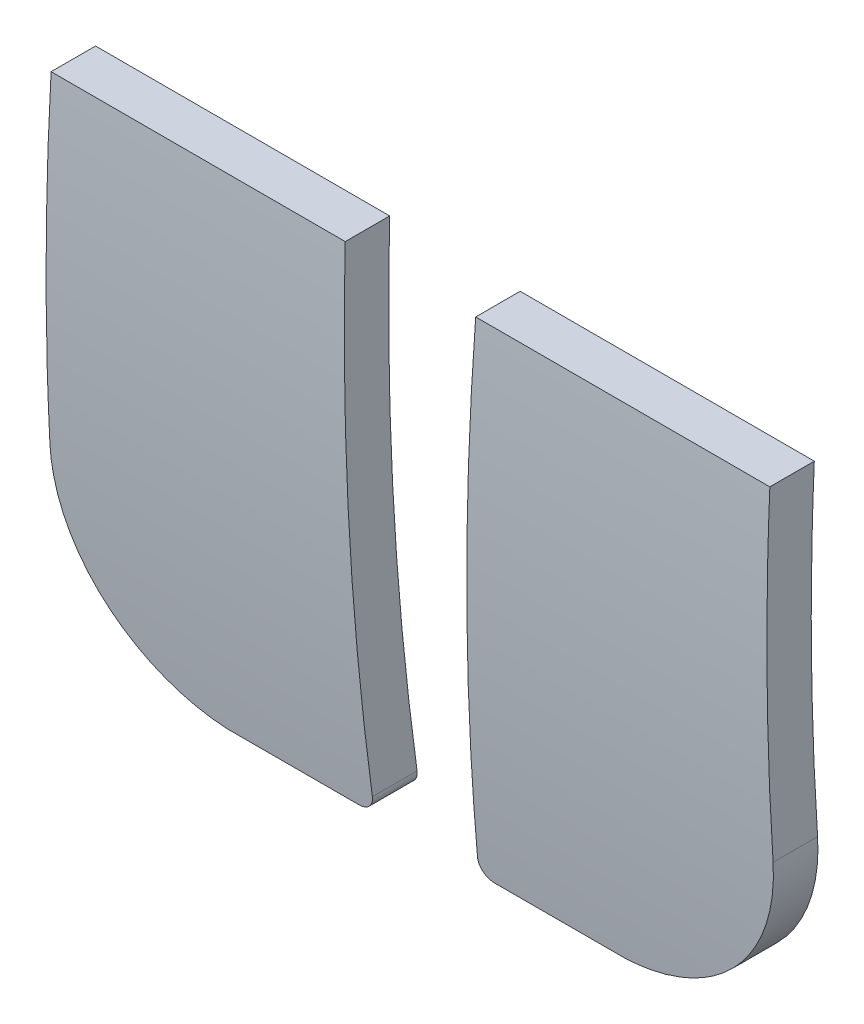
ISO-10303-21;
HEADER;
FILE_DESCRIPTION(('STEP AP214'),'2;1');
FILE_NAME('part.step','',(''),(''),'','','');
FILE_SCHEMA(('AUTOMOTIVE_DESIGN { 1 0 10303 214 1 1 1 1 }'));
ENDSEC;
DATA;
#1=APPLICATION_CONTEXT('core data for automotive mechanical design processes');
#2=APPLICATION_PROTOCOL_DEFINITION('international standard','automotive_design',2000,#1);
#3=PRODUCT_CONTEXT('',#1,'mechanical');
#4=PRODUCT('Part','Part','',(#3));
#5=PRODUCT_RELATED_PRODUCT_CATEGORY('part','',(#4));
#6=PRODUCT_DEFINITION_FORMATION('','',#4);
#7=PRODUCT_DEFINITION_CONTEXT('part definition',#1,'design');
#8=PRODUCT_DEFINITION('design','',#6,#7);
#9=PRODUCT_DEFINITION_SHAPE('','',#8);
#10=(LENGTH_UNIT() NAMED_UNIT(*) SI_UNIT(.MILLI.,.METRE.));
#11=(NAMED_UNIT(*) PLANE_ANGLE_UNIT() SI_UNIT($,.RADIAN.));
#12=(NAMED_UNIT(*) SI_UNIT($,.STERADIAN.) SOLID_ANGLE_UNIT());
#13=UNCERTAINTY_MEASURE_WITH_UNIT(LENGTH_MEASURE(1.E-05),#10,'distance_accuracy_value','');
#14=(GEOMETRIC_REPRESENTATION_CONTEXT(3) GLOBAL_UNCERTAINTY_ASSIGNED_CONTEXT((#13)) GLOBAL_UNIT_ASSIGNED_CONTEXT((#10,
#11,#12)) REPRESENTATION_CONTEXT('',''));
#15=CARTESIAN_POINT('',(0.,0.,0.));
#16=DIRECTION('',(0.,0.,1.));
#17=DIRECTION('',(1.,0.,0.));
#18=AXIS2_PLACEMENT_3D('',#15,#16,#17);
#19=CARTESIAN_POINT('',(536.140350875402,475.456721631804,110.999999999999));
#20=DIRECTION('',(-0.999654061556553,-0.0263012777918944,0.));
#21=DIRECTION('',(0.0263012777918946,-0.999654061556546,0.));
#22=AXIS2_PLACEMENT_3D('',#19,#20,#21);
#23=PLANE('',#22);
#24=CARTESIAN_POINT('',(535.619107961521,495.26802509934,-119.051940911858));
#25=DIRECTION('',(-0.999654061556553,-0.0263012777918944,0.));
#26=DIRECTION('',(-0.0263012777918946,0.999654061556546,0.));
#27=AXIS2_PLACEMENT_3D('',#24,#25,#26);
#28=ELLIPSE('',#27,174.492026428752,174.45060758446);
#29=CARTESIAN_POINT('',(536.140350875403,475.456721631805,54.2698450307609));
#30=VERTEX_POINT('',#29);
#31=CARTESIAN_POINT('',(535.376458863718,504.490586758564,55.1546616225943));
#32=VERTEX_POINT('',#31);
#33=EDGE_CURVE('E159',#30,#32,#28,.T.);
#34=ORIENTED_EDGE('',*,*,#33,.T.);
#35=DIRECTION('',(0.,0.,0.999999999999992));
#36=VECTOR('',#35,1.);
#37=CARTESIAN_POINT('',(535.376458863718,504.490586758564,110.999999999999));
#38=LINE('',#37,#36);
#39=CARTESIAN_POINT('',(535.376458863718,504.490586758563,57.8345842835043));
#40=VERTEX_POINT('',#39);
#41=EDGE_CURVE('E100',#32,#40,#38,.T.);
#42=ORIENTED_EDGE('',*,*,#41,.T.);
#43=CARTESIAN_POINT('',(535.619107961521,495.26802509934,-119.051940911858));
#44=DIRECTION('',(-0.999654061556553,-0.0263012777918944,0.));
#45=DIRECTION('',(-0.0263012777918946,0.999654061556546,0.));
#46=AXIS2_PLACEMENT_3D('',#43,#44,#45);
#47=ELLIPSE('',#46,177.168892743277,177.12683849626);
#48=CARTESIAN_POINT('',(536.140350875403,475.456721631805,56.9632399999936));
#49=VERTEX_POINT('',#48);
#50=EDGE_CURVE('E125',#40,#49,#47,.F.);
#51=ORIENTED_EDGE('',*,*,#50,.T.);
#52=DIRECTION('',(0.,0.,-0.999999999999992));
#53=VECTOR('',#52,1.);
#54=CARTESIAN_POINT('',(536.140350875402,475.456721631804,110.999999999999));
#55=LINE('',#54,#53);
#56=EDGE_CURVE('E174',#49,#30,#55,.T.);
#57=ORIENTED_EDGE('',*,*,#56,.T.);
#58=EDGE_LOOP('',(#34,#42,#51,#57));
#59=FACE_BOUND('',#58,.T.);
#60=ADVANCED_FACE('F54',(#59),#23,.F.);
#61=CARTESIAN_POINT('',(535.231574455896,475.432811379267,110.999999999999));
#62=DIRECTION('',(0.,0.,-0.999999999999992));
#63=DIRECTION('',(-1.,0.,0.));
#64=AXIS2_PLACEMENT_3D('',#61,#62,#63);
#65=CYLINDRICAL_SURFACE('',#64,0.909090909000402);
#66=ORIENTED_EDGE('',*,*,#56,.F.);
#67=CARTESIAN_POINT('',(536.140350875403,475.456721631805,56.9632399999936));
#68=CARTESIAN_POINT('',(536.14174518373,475.40533194349,56.9574554709176));
#69=CARTESIAN_POINT('',(536.138698001544,475.353841025974,56.9516372540305));
#70=CARTESIAN_POINT('',(536.123996000323,475.25212307305,56.9401044015353));
#71=CARTESIAN_POINT('',(536.112346619781,475.201895259819,56.9343897028185));
#72=CARTESIAN_POINT('',(536.080708378065,475.104075764882,56.9232241972105));
#73=CARTESIAN_POINT('',(536.060715163194,475.056485474107,56.9177735297465));
#74=CARTESIAN_POINT('',(536.012957868618,474.965338029349,56.907304634822));
#75=CARTESIAN_POINT('',(535.985195364171,474.921780060175,56.9022863199694));
#76=CARTESIAN_POINT('',(535.922743558831,474.840046086445,56.89284804899));
#77=CARTESIAN_POINT('',(535.888071364855,474.801857179763,56.8884266594746));
#78=CARTESIAN_POINT('',(535.812722900101,474.731842494284,56.8803075346735));
#79=CARTESIAN_POINT('',(535.772045848254,474.700017544534,56.8766098936734));
#80=CARTESIAN_POINT('',(535.686109211178,474.643847029556,56.8700792423017));
#81=CARTESIAN_POINT('',(535.640878345901,474.61945806932,56.8672412160468));
#82=CARTESIAN_POINT('',(535.546923853915,474.578632759,56.8624945115349));
#83=CARTESIAN_POINT('',(535.498201997904,474.562192409558,56.8605853659069));
#84=CARTESIAN_POINT('',(535.412994128215,474.541257365361,56.8581651903256));
#85=CARTESIAN_POINT('',(535.377010108983,474.534688361436,56.857410145781));
#86=CARTESIAN_POINT('',(535.304547175538,474.525918358229,56.8564148293218));
#87=CARTESIAN_POINT('',(535.268068849955,474.523712556748,56.8561739914414));
#88=CARTESIAN_POINT('',(535.231574455899,474.523720470266,56.8561945203728));
#89=B_SPLINE_CURVE_WITH_KNOTS('',3,(#67,#68,#69,#70,#71,#72,#73,#74,#75,#76,#77,#78,#79,#80,#81,
#82,#83,#84,#85,#86,#87,#88),.UNSPECIFIED.,.F.,.F.,(4,2,2,2,2,2,2,2,2,2,4),(0.,0.15499568747238,
0.30989346716666,0.464872171625636,0.619819476190306,0.774387826309944,0.928976299305122,
1.08264454954409,1.23623540064641,1.34574069218064,1.45512539353351),.UNSPECIFIED.);
#90=CARTESIAN_POINT('',(535.231574455899,474.523720470266,56.8561945203729));
#91=VERTEX_POINT('',#90);
#92=EDGE_CURVE('E166',#49,#91,#89,.T.);
#93=ORIENTED_EDGE('',*,*,#92,.T.);
#94=DIRECTION('',(0.,0.,-0.999999999999992));
#95=VECTOR('',#94,1.);
#96=CARTESIAN_POINT('',(535.231574455899,474.523720470266,110.999999999999));
#97=LINE('',#96,#95);
#98=CARTESIAN_POINT('',(535.231574455899,474.523720470266,54.1611350441775));
#99=VERTEX_POINT('',#98);
#100=EDGE_CURVE('E158',#91,#99,#97,.T.);
#101=ORIENTED_EDGE('',*,*,#100,.T.);
#102=CARTESIAN_POINT('',(535.231574455899,474.523720470266,54.1611350441775));
#103=CARTESIAN_POINT('',(535.282456947394,474.523675843275,54.161101545679));
#104=CARTESIAN_POINT('',(535.333324549089,474.527989635338,54.1615912439828));
#105=CARTESIAN_POINT('',(535.433567432787,474.545002286265,54.1635734579469));
#106=CARTESIAN_POINT('',(535.482944158427,474.557692742551,54.165064968722));
#107=CARTESIAN_POINT('',(535.57886989596,474.59113498582,54.1690081401541));
#108=CARTESIAN_POINT('',(535.625417745703,474.611890060344,54.1714601923791));
#109=CARTESIAN_POINT('',(535.714354599843,474.660837071031,54.1772420230476));
#110=CARTESIAN_POINT('',(535.756744032862,474.689028239626,54.1805717108999));
#111=CARTESIAN_POINT('',(535.836320112265,474.752137879461,54.188014619178));
#112=CARTESIAN_POINT('',(535.873489797929,474.787077443125,54.1921302957828));
#113=CARTESIAN_POINT('',(535.941448036771,474.862629269284,54.2010095048129));
#114=CARTESIAN_POINT('',(535.972235561353,474.903242444417,54.2057731414636));
#115=CARTESIAN_POINT('',(536.026769120351,474.989275847245,54.2158357106725));
#116=CARTESIAN_POINT('',(536.050466164029,475.034726705185,54.2211380430928));
#117=CARTESIAN_POINT('',(536.089886829561,475.12891913603,54.23209117822));
#118=CARTESIAN_POINT('',(536.105612989336,475.177659655903,54.2377418693661));
#119=CARTESIAN_POINT('',(536.12585769826,475.264906228526,54.2478218102338));
#120=CARTESIAN_POINT('',(536.1321739604,475.303010246547,54.2522129635392));
#121=CARTESIAN_POINT('',(536.139929286843,475.379666267343,54.2610236763373));
#122=CARTESIAN_POINT('',(536.141373547402,475.418217748793,54.2654432005254));
#123=CARTESIAN_POINT('',(536.140350875403,475.456721631805,54.2698450307608));
#124=B_SPLINE_CURVE_WITH_KNOTS('',3,(#102,#103,#104,#105,#106,#107,#108,#109,#110,#111,#112,
#113,#114,#115,#116,#117,#118,#119,#120,#121,#122,#123),.UNSPECIFIED.,.F.,.F.,(4,2,2,2,2,2,2,2,
2,2,4),(0.,0.152440184345193,0.30472768882701,0.457077338519211,0.609411268537098,
0.762229264094853,0.915071869804436,1.06894735026415,1.22277380610403,1.33909581069484,
1.45529371218905),.UNSPECIFIED.);
#125=EDGE_CURVE('E149',#99,#30,#124,.T.);
#126=ORIENTED_EDGE('',*,*,#125,.T.);
#127=EDGE_LOOP('',(#66,#93,#101,#126));
#128=FACE_BOUND('',#127,.T.);
#129=ADVANCED_FACE('F160',(#128),#65,.T.);
#130=CARTESIAN_POINT('',(527.266966018069,474.523720470267,110.999999999998));
#131=DIRECTION('',(-1.11515645367699E-13,0.999999999999996,0.));
#132=DIRECTION('',(-1.,-1.11515641556051E-13,0.));
#133=AXIS2_PLACEMENT_3D('',#130,#131,#132);
#134=PLANE('',#133);
#135=ORIENTED_EDGE('',*,*,#100,.F.);
#136=CARTESIAN_POINT('',(-4058.43512311314,474.523720469757,-119.051940911858));
#137=DIRECTION('',(-1.11515645367699E-13,0.999999999999996,0.));
#138=DIRECTION('',(-1.,-1.11515641556051E-13,0.));
#139=AXIS2_PLACEMENT_3D('',#136,#137,#138);
#140=ELLIPSE('',#139,39227.0848358482,177.12683849626);
#141=CARTESIAN_POINT('',(527.26696601807,474.523720470267,56.8604314648169));
#142=VERTEX_POINT('',#141);
#143=EDGE_CURVE('E157',#91,#142,#140,.F.);
#144=ORIENTED_EDGE('',*,*,#143,.T.);
#145=DIRECTION('',(0.,0.,-0.999999999999992));
#146=VECTOR('',#145,1.);
#147=CARTESIAN_POINT('',(527.266966018069,474.523720470267,110.999999999998));
#148=LINE('',#147,#146);
#149=CARTESIAN_POINT('',(527.266966018069,474.523720470267,54.1654379105254));
#150=VERTEX_POINT('',#149);
#151=EDGE_CURVE('E178',#142,#150,#148,.T.);
#152=ORIENTED_EDGE('',*,*,#151,.T.);
#153=CARTESIAN_POINT('',(-4058.43512311314,474.523720469757,-119.051940911858));
#154=DIRECTION('',(-1.11515645367699E-13,0.999999999999996,0.));
#155=DIRECTION('',(-1.,-1.11515641556051E-13,0.));
#156=AXIS2_PLACEMENT_3D('',#153,#154,#155);
#157=ELLIPSE('',#156,38634.3980476193,174.45060758446);
#158=EDGE_CURVE('E136',#150,#99,#157,.T.);
#159=ORIENTED_EDGE('',*,*,#158,.T.);
#160=EDGE_LOOP('',(#135,#144,#152,#159));
#161=FACE_BOUND('',#160,.T.);
#162=ADVANCED_FACE('F163',(#161),#134,.F.);
#163=CARTESIAN_POINT('',(527.925237363076,484.907688786865,110.999999999998));
#164=DIRECTION('',(0.,0.,-0.999999999999992));
#165=DIRECTION('',(-1.,0.,0.));
#166=AXIS2_PLACEMENT_3D('',#163,#164,#165);
#167=CYLINDRICAL_SURFACE('',#166,10.4048123079564);
#168=ORIENTED_EDGE('',*,*,#151,.F.);
#169=CARTESIAN_POINT('',(527.26696601807,474.523720470267,56.8604314648169));
#170=CARTESIAN_POINT('',(526.975887508819,474.542140275798,56.8627490500509));
#171=CARTESIAN_POINT('',(526.685606856177,474.572861274735,56.8665211784255));
#172=CARTESIAN_POINT('',(526.108714324281,474.658532180577,56.876865907868));
#173=CARTESIAN_POINT('',(525.82210217927,474.713480322066,56.8834383048809));
#174=CARTESIAN_POINT('',(525.254854101809,474.847169450611,56.899267586558));
#175=CARTESIAN_POINT('',(524.974212601217,474.925887126533,56.908521840729));
#176=CARTESIAN_POINT('',(524.420606220098,475.10654366231,56.9295489857613));
#177=CARTESIAN_POINT('',(524.147641289298,475.208482370053,56.9413218601242));
#178=CARTESIAN_POINT('',(523.611216907702,475.434878653158,56.9671837642438));
#179=CARTESIAN_POINT('',(523.347760828529,475.559344123718,56.9812736058944));
#180=CARTESIAN_POINT('',(522.832296341451,475.829869960439,57.0115216673345));
#181=CARTESIAN_POINT('',(522.580288228378,475.97593088236,57.0276799403539));
#182=CARTESIAN_POINT('',(522.089520284619,476.288572647983,57.0617863352253));
#183=CARTESIAN_POINT('',(521.850758525195,476.455150492881,57.079734195434));
#184=CARTESIAN_POINT('',(521.388100493214,476.807655501322,57.1171219966519));
#185=CARTESIAN_POINT('',(521.164204189059,476.993582623733,57.1365619344892));
#186=CARTESIAN_POINT('',(520.731940015739,477.384271257166,57.1766994668965));
#187=CARTESIAN_POINT('',(520.523639414842,477.589106702207,57.1974018808239));
#188=CARTESIAN_POINT('',(520.125031288809,478.015513287331,57.2396619104286));
#189=CARTESIAN_POINT('',(519.934723842307,478.237084500545,57.2612195298427));
#190=CARTESIAN_POINT('',(519.573360901964,478.695484126932,57.3048649879234));
#191=CARTESIAN_POINT('',(519.402312192417,478.932317870743,57.3269530101316));
#192=CARTESIAN_POINT('',(519.080738304926,479.419506488047,57.3713232223724));
#193=CARTESIAN_POINT('',(518.930212703041,479.669861082096,57.393605408384));
#194=CARTESIAN_POINT('',(518.650028462786,480.183636927127,57.4381597674262));
#195=CARTESIAN_POINT('',(518.520478759992,480.447117647564,57.4604313245909));
#196=CARTESIAN_POINT('',(518.284092473592,480.984106014947,57.5045474410512));
#197=CARTESIAN_POINT('',(518.177255405818,481.257613448006,57.52639200944));
#198=CARTESIAN_POINT('',(517.987142506752,481.812480112703,57.5693564559241));
#199=CARTESIAN_POINT('',(517.903845875152,482.093832169765,57.5904769592088));
#200=CARTESIAN_POINT('',(517.761316792545,482.662528329023,57.631757960082));
#201=CARTESIAN_POINT('',(517.702075411093,482.949870165802,57.6519188114802));
#202=CARTESIAN_POINT('',(517.610158765996,483.51568263316,57.6901979212879));
#203=CARTESIAN_POINT('',(517.576415949564,483.793976921613,57.708367182422));
#204=CARTESIAN_POINT('',(517.531506739489,484.351966198592,57.7434607465613));
#205=CARTESIAN_POINT('',(517.520300956681,484.631657885334,57.7603871717455));
#206=CARTESIAN_POINT('',(517.520425715415,484.911395605456,57.7766353582668));
#207=B_SPLINE_CURVE_WITH_KNOTS('',3,(#169,#170,#171,#172,#173,#174,#175,#176,#177,#178,#179,
#180,#181,#182,#183,#184,#185,#186,#187,#188,#189,#190,#191,#192,#193,#194,#195,#196,#197,#198,
#199,#200,#201,#202,#203,#204,#205,#206),.UNSPECIFIED.,.F.,.F.,(4,2,2,2,2,2,2,2,2,2,2,2,2,2,2,2,
2,2,4),(0.,0.874737972223941,1.7494122133495,2.6232314193154,3.49704490143656,4.37116523357247,
5.24530806519936,6.11932328126851,6.99333663943121,7.87092529667561,8.7485177890101,
9.62641847076994,10.5043010151818,11.3866058320865,12.26889183892,13.1503958036979,
14.031572212725,14.873425606386,15.7138063652879),.UNSPECIFIED.);
#208=CARTESIAN_POINT('',(517.520425715415,484.911395605456,57.7766353582669));
#209=VERTEX_POINT('',#208);
#210=EDGE_CURVE('E179',#142,#209,#207,.T.);
#211=ORIENTED_EDGE('',*,*,#210,.T.);
#212=DIRECTION('',(0.,0.,-0.999999999999992));
#213=VECTOR('',#212,1.);
#214=CARTESIAN_POINT('',(517.520425715415,484.911395605455,111.));
#215=LINE('',#214,#213);
#216=CARTESIAN_POINT('',(517.520425715415,484.911395605456,55.0958209360234));
#217=VERTEX_POINT('',#216);
#218=EDGE_CURVE('E135',#209,#217,#215,.T.);
#219=ORIENTED_EDGE('',*,*,#218,.T.);
#220=CARTESIAN_POINT('',(517.520425715415,484.911395605456,55.0958209360234));
#221=CARTESIAN_POINT('',(517.520289806741,484.617995009349,55.0785178812559));
#222=CARTESIAN_POINT('',(517.532625518532,484.324641524004,55.0604554932544));
#223=CARTESIAN_POINT('',(517.581990513403,483.740124473096,55.0229882394197));
#224=CARTESIAN_POINT('',(517.619018172725,483.448960764804,55.0035834619381));
#225=CARTESIAN_POINT('',(517.717478143131,482.87111046721,54.9636212459886));
#226=CARTESIAN_POINT('',(517.778890957637,482.584420490895,54.9430647396088));
#227=CARTESIAN_POINT('',(517.925657308827,482.017309248906,54.9010080948807));
#228=CARTESIAN_POINT('',(518.011010677076,481.736887939144,54.8795079631722));
#229=CARTESIAN_POINT('',(518.205080884662,481.18418224198,54.8358094010826));
#230=CARTESIAN_POINT('',(518.313806852309,480.911901081224,54.813610700771));
#231=CARTESIAN_POINT('',(518.553827167054,480.377502333744,54.7688070084009));
#232=CARTESIAN_POINT('',(518.685122020641,480.115384975277,54.7462020072343));
#233=CARTESIAN_POINT('',(518.969322971436,479.603211993992,54.7008986364489));
#234=CARTESIAN_POINT('',(519.122225121594,479.353154179398,54.6782002846162));
#235=CARTESIAN_POINT('',(519.448582719488,478.866810982683,54.6330323261353));
#236=CARTESIAN_POINT('',(519.622038076072,478.630525539489,54.610562718473));
#237=CARTESIAN_POINT('',(519.988578537358,478.173031049163,54.5661543039174));
#238=CARTESIAN_POINT('',(520.181694312071,477.951846485598,54.5442163945591));
#239=CARTESIAN_POINT('',(520.58597151068,477.526538647642,54.5012516040534));
#240=CARTESIAN_POINT('',(520.797132902112,477.322415342561,54.4802247212672));
#241=CARTESIAN_POINT('',(521.236094477772,476.932623146271,54.4394149151141));
#242=CARTESIAN_POINT('',(521.463900313567,476.746960574339,54.4196324185574));
#243=CARTESIAN_POINT('',(521.934476602399,476.395512729864,54.381649101098));
#244=CARTESIAN_POINT('',(522.177246655536,476.229726926489,54.3634482379596));
#245=CARTESIAN_POINT('',(522.675602648814,475.919504717786,54.3289685874537));
#246=CARTESIAN_POINT('',(522.931165423145,475.775031467053,54.3126864929384));
#247=CARTESIAN_POINT('',(523.453679424084,475.508149052617,54.2822910483605));
#248=CARTESIAN_POINT('',(523.72063032688,475.385739262074,54.2681776366857));
#249=CARTESIAN_POINT('',(524.263761305277,475.163989776158,54.2423815967991));
#250=CARTESIAN_POINT('',(524.539932290285,475.064628082489,54.2306966518509));
#251=CARTESIAN_POINT('',(525.099667261961,474.889593778648,54.2099536965693));
#252=CARTESIAN_POINT('',(525.383228326988,474.813911956127,54.2008946647593));
#253=CARTESIAN_POINT('',(525.932469565764,474.691939524672,54.1861886821699));
#254=CARTESIAN_POINT('',(526.197725689705,474.643757519325,54.1803239655258));
#255=CARTESIAN_POINT('',(526.730751196714,474.568163910431,54.1710370426466));
#256=CARTESIAN_POINT('',(526.998515398022,474.540716278693,54.1676106002531));
#257=CARTESIAN_POINT('',(527.266966018069,474.523720470267,54.1654379105254));
#258=B_SPLINE_CURVE_WITH_KNOTS('',3,(#220,#221,#222,#223,#224,#225,#226,#227,#228,#229,#230,
#231,#232,#233,#234,#235,#236,#237,#238,#239,#240,#241,#242,#243,#244,#245,#246,#247,#248,#249,
#250,#251,#252,#253,#254,#255,#256,#257),.UNSPECIFIED.,.F.,.F.,(4,2,2,2,2,2,2,2,2,2,2,2,2,2,2,2,
2,2,4),(0.,0.881457427142949,1.76285689477074,2.64355307451578,3.52424305824527,
4.40527762769156,5.28633197183449,6.16722557954877,7.04811528070232,7.93040085128707,
8.81268483480478,9.69526979990165,10.5778311893314,11.458848449962,12.3398406762283,
13.219988545914,14.0997935784424,14.9079610198805,15.7147209332295),.UNSPECIFIED.);
#259=EDGE_CURVE('E116',#217,#150,#258,.T.);
#260=ORIENTED_EDGE('',*,*,#259,.T.);
#261=EDGE_LOOP('',(#168,#211,#219,#260));
#262=FACE_BOUND('',#261,.T.);
#263=ADVANCED_FACE('F138',(#262),#167,.T.);
#264=CARTESIAN_POINT('',(517.664410905554,508.286343161836,110.999999999999));
#265=DIRECTION('',(0.99998102892226,-0.00615969119236416,0.));
#266=DIRECTION('',(0.00615969119236419,0.999981028922248,0.));
#267=AXIS2_PLACEMENT_3D('',#264,#265,#266);
#268=PLANE('',#267);
#269=CARTESIAN_POINT('',(517.583718921342,495.186586878209,-119.051940911858));
#270=DIRECTION('',(0.99998102892226,-0.00615969119236416,0.));
#271=DIRECTION('',(-0.00615969119236419,-0.999981028922248,0.));
#272=AXIS2_PLACEMENT_3D('',#269,#270,#271);
#273=ELLIPSE('',#272,177.136931591836,177.12683849626);
#274=CARTESIAN_POINT('',(517.641029774707,504.490586758568,57.8303902639352));
#275=VERTEX_POINT('',#274);
#276=EDGE_CURVE('E112',#209,#275,#273,.F.);
#277=ORIENTED_EDGE('',*,*,#276,.T.);
#278=DIRECTION('',(0.,0.,-0.999999999999992));
#279=VECTOR('',#278,1.);
#280=CARTESIAN_POINT('',(517.641029774707,504.490586758564,111.));
#281=LINE('',#280,#279);
#282=CARTESIAN_POINT('',(517.641029774707,504.490586758564,55.1504030823898));
#283=VERTEX_POINT('',#282);
#284=EDGE_CURVE('E102',#275,#283,#281,.T.);
#285=ORIENTED_EDGE('',*,*,#284,.T.);
#286=CARTESIAN_POINT('',(517.583718921342,495.186586878209,-119.051940911858));
#287=DIRECTION('',(0.99998102892226,-0.00615969119236416,0.));
#288=DIRECTION('',(-0.00615969119236419,-0.999981028922248,0.));
#289=AXIS2_PLACEMENT_3D('',#286,#287,#288);
#290=ELLIPSE('',#289,174.460548182229,174.45060758446);
#291=EDGE_CURVE('E110',#283,#217,#290,.T.);
#292=ORIENTED_EDGE('',*,*,#291,.T.);
#293=ORIENTED_EDGE('',*,*,#218,.F.);
#294=EDGE_LOOP('',(#277,#285,#292,#293));
#295=FACE_BOUND('',#294,.T.);
#296=ADVANCED_FACE('F108',(#295),#268,.F.);
#297=CARTESIAN_POINT('',(648.010941806105,495.775526822629,-119.051940911858));
#298=DIRECTION('',(-0.999989805430504,-0.00451542191426788,0.));
#299=DIRECTION('',(0.00451542191426791,-0.999989805430496,0.));
#300=AXIS2_PLACEMENT_3D('',#297,#298,#299);
#301=CYLINDRICAL_SURFACE('',#300,177.12683849626);
#302=ORIENTED_EDGE('',*,*,#50,.F.);
#303=CARTESIAN_POINT('',(2578.0567393239,504.49058675856,-119.051940911858));
#304=DIRECTION('',(0.,-0.999999999999996,0.));
#305=DIRECTION('',(-1.,0.,0.));
#306=AXIS2_PLACEMENT_3D('',#303,#304,#305);
#307=ELLIPSE('',#306,39227.0848348795,177.12683849626);
#308=EDGE_CURVE('E64',#40,#275,#307,.T.);
#309=ORIENTED_EDGE('',*,*,#308,.T.);
#310=ORIENTED_EDGE('',*,*,#276,.F.);
#311=ORIENTED_EDGE('',*,*,#210,.F.);
#312=ORIENTED_EDGE('',*,*,#143,.F.);
#313=ORIENTED_EDGE('',*,*,#92,.F.);
#314=EDGE_LOOP('',(#302,#309,#310,#311,#312,#313));
#315=FACE_BOUND('',#314,.T.);
#316=ADVANCED_FACE('F145',(#315),#301,.T.);
#317=CARTESIAN_POINT('',(648.010941806105,495.775526822629,-119.051940911858));
#318=DIRECTION('',(-0.999989805430504,-0.00451542191426788,0.));
#319=DIRECTION('',(0.00451542191426791,-0.999989805430496,0.));
#320=AXIS2_PLACEMENT_3D('',#317,#318,#319);
#321=CYLINDRICAL_SURFACE('',#320,174.45060758446);
#322=ORIENTED_EDGE('',*,*,#291,.F.);
#323=CARTESIAN_POINT('',(2578.0567393239,504.49058675856,-119.051940911858));
#324=DIRECTION('',(0.,-0.999999999999996,0.));
#325=DIRECTION('',(-1.,0.,0.));
#326=AXIS2_PLACEMENT_3D('',#323,#324,#325);
#327=ELLIPSE('',#326,38634.3980466652,174.45060758446);
#328=EDGE_CURVE('E13',#283,#32,#327,.F.);
#329=ORIENTED_EDGE('',*,*,#328,.T.);
#330=ORIENTED_EDGE('',*,*,#33,.F.);
#331=ORIENTED_EDGE('',*,*,#125,.F.);
#332=ORIENTED_EDGE('',*,*,#158,.F.);
#333=ORIENTED_EDGE('',*,*,#259,.F.);
#334=EDGE_LOOP('',(#322,#329,#330,#331,#332,#333));
#335=FACE_BOUND('',#334,.T.);
#336=ADVANCED_FACE('F114',(#335),#321,.F.);
#337=CARTESIAN_POINT('',(517.641029774711,504.490586758564,-105.));
#338=DIRECTION('',(0.,-0.999999999999996,0.));
#339=DIRECTION('',(0.,0.,-0.999999999999992));
#340=AXIS2_PLACEMENT_3D('',#337,#338,#339);
#341=PLANE('',#340);
#342=ORIENTED_EDGE('',*,*,#41,.F.);
#343=ORIENTED_EDGE('',*,*,#328,.F.);
#344=ORIENTED_EDGE('',*,*,#284,.F.);
#345=ORIENTED_EDGE('',*,*,#308,.F.);
#346=EDGE_LOOP('',(#342,#343,#344,#345));
#347=FACE_BOUND('',#346,.T.);
#348=ADVANCED_FACE('F56',(#347),#341,.F.);
#349=CLOSED_SHELL('',(#60,#129,#162,#263,#296,#316,#336,#348));
#350=MANIFOLD_SOLID_BREP('B2',#349);
#351=CARTESIAN_POINT('',(543.386399128993,475.432811379267,110.999999999998));
#352=DIRECTION('',(0.,0.,-0.999999999999992));
#353=DIRECTION('',(-1.,0.,0.));
#354=AXIS2_PLACEMENT_3D('',#351,#352,#353);
#355=CYLINDRICAL_SURFACE('',#354,0.909090909000402);
#356=DIRECTION('',(0.,0.,-0.999999999999992));
#357=VECTOR('',#356,1.);
#358=CARTESIAN_POINT('',(543.386399128993,474.523720470267,110.999999999999));
#359=LINE('',#358,#357);
#360=CARTESIAN_POINT('',(543.386399128994,474.523720470267,56.8518486623192));
#361=VERTEX_POINT('',#360);
#362=CARTESIAN_POINT('',(543.386399128994,474.523720470267,54.1567215662743));
#363=VERTEX_POINT('',#362);
#364=EDGE_CURVE('E440',#361,#363,#359,.T.);
#365=ORIENTED_EDGE('',*,*,#364,.F.);
#366=CARTESIAN_POINT('',(543.386399128994,474.523720470267,56.8518486623193));
#367=CARTESIAN_POINT('',(543.335504834858,474.523675886622,56.8518699161749));
#368=CARTESIAN_POINT('',(543.284626030305,474.527991617218,56.8524074753501));
#369=CARTESIAN_POINT('',(543.184362054058,474.54501167573,56.8544704551497));
#370=CARTESIAN_POINT('',(543.134975440391,474.55770761544,56.8559948879295));
#371=CARTESIAN_POINT('',(543.039031600906,474.59116408154,56.8599878964958));
#372=CARTESIAN_POINT('',(542.992475535149,474.611927889009,56.8624568564008));
#373=CARTESIAN_POINT('',(542.903524181437,474.660895622466,56.8682560862241));
#374=CARTESIAN_POINT('',(542.86112846379,474.689098778986,56.8715862670637));
#375=CARTESIAN_POINT('',(542.781542916913,474.752235247181,56.8790138203234));
#376=CARTESIAN_POINT('',(542.744369973962,474.787189559273,56.8831135854948));
#377=CARTESIAN_POINT('',(542.676408435411,474.862773932739,56.8919452818127));
#378=CARTESIAN_POINT('',(542.645620868446,474.903404906818,56.896677314611));
#379=CARTESIAN_POINT('',(542.591095758783,474.989469956477,56.906661103508));
#380=CARTESIAN_POINT('',(542.567406114902,475.034933978406,56.9119160853426));
#381=CARTESIAN_POINT('',(542.528003332903,475.129153389746,56.9227612373451));
#382=CARTESIAN_POINT('',(542.512287621612,475.177907711622,56.9283512987316));
#383=CARTESIAN_POINT('',(542.492076581692,475.26512612405,56.9383089020854));
#384=CARTESIAN_POINT('',(542.485776097476,475.303186782808,56.9426406341893));
#385=CARTESIAN_POINT('',(542.478041025711,475.379754914406,56.9513270458765));
#386=CARTESIAN_POINT('',(542.476601250616,475.418261866858,56.9556816960248));
#387=CARTESIAN_POINT('',(542.477622709486,475.456721631804,56.9600164958012));
#388=B_SPLINE_CURVE_WITH_KNOTS('',3,(#366,#367,#368,#369,#370,#371,#372,#373,#374,#375,#376,
#377,#378,#379,#380,#381,#382,#383,#384,#385,#386,#387),.UNSPECIFIED.,.F.,.F.,(4,2,2,2,2,2,2,2,
2,2,4),(0.,0.152475469555057,0.304798549130712,0.457183641132067,0.609552977797093,
0.762404144638338,0.915279915542153,1.06916523136135,1.22300085702808,1.33916870745918,
1.45521253958617),.UNSPECIFIED.);
#389=CARTESIAN_POINT('',(542.477622709486,475.456721631804,56.9600164958013));
#390=VERTEX_POINT('',#389);
#391=EDGE_CURVE('E412',#361,#390,#388,.T.);
#392=ORIENTED_EDGE('',*,*,#391,.T.);
#393=DIRECTION('',(0.,0.,-0.999999999999992));
#394=VECTOR('',#393,1.);
#395=CARTESIAN_POINT('',(542.477622709483,475.456721631804,110.999999999999));
#396=LINE('',#395,#394);
#397=CARTESIAN_POINT('',(542.477622709486,475.456721631804,54.2665714328503));
#398=VERTEX_POINT('',#397);
#399=EDGE_CURVE('E446',#390,#398,#396,.T.);
#400=ORIENTED_EDGE('',*,*,#399,.T.);
#401=CARTESIAN_POINT('',(542.477622709486,475.456721631804,54.2665714328503));
#402=CARTESIAN_POINT('',(542.476228102598,475.405318767319,54.2606883549077));
#403=CARTESIAN_POINT('',(542.47927714339,475.353815319725,54.2547665125188));
#404=CARTESIAN_POINT('',(542.493986848688,475.252073774487,54.2430192782357));
#405=CARTESIAN_POINT('',(542.505642087817,475.201834900275,54.23719382794));
#406=CARTESIAN_POINT('',(542.53729569324,475.10399516441,54.2258025498615));
#407=CARTESIAN_POINT('',(542.557298404374,475.056395691197,54.2202368589627));
#408=CARTESIAN_POINT('',(542.605078342131,474.965231996617,54.2095369943083));
#409=CARTESIAN_POINT('',(542.632853992656,474.92166695958,54.204402733347));
#410=CARTESIAN_POINT('',(542.695335455557,474.839922047727,54.1947354068276));
#411=CARTESIAN_POINT('',(542.730024072168,474.801729204067,54.1902008950719));
#412=CARTESIAN_POINT('',(542.80540901365,474.731710175985,54.1818615061038));
#413=CARTESIAN_POINT('',(542.846106119877,474.699884820873,54.1780567239351));
#414=CARTESIAN_POINT('',(542.932078805037,474.64372298097,54.1713224730028));
#415=CARTESIAN_POINT('',(542.977324852705,474.619341874854,54.1683877919939));
#416=CARTESIAN_POINT('',(543.071310752314,474.578535825753,54.1634601550847));
#417=CARTESIAN_POINT('',(543.120048814083,474.562106839167,54.1614667205793));
#418=CARTESIAN_POINT('',(543.20522599945,474.541209319394,54.1589170069493));
#419=CARTESIAN_POINT('',(543.241161466193,474.534658352511,54.158112111623));
#420=CARTESIAN_POINT('',(543.313525923435,474.525912393749,54.1570239949189));
#421=CARTESIAN_POINT('',(543.349954326708,474.523712611641,54.1567401998855));
#422=CARTESIAN_POINT('',(543.386399128994,474.523720470267,54.1567215662743));
#423=B_SPLINE_CURVE_WITH_KNOTS('',3,(#401,#402,#403,#404,#405,#406,#407,#408,#409,#410,#411,
#412,#413,#414,#415,#416,#417,#418,#419,#420,#421,#422),.UNSPECIFIED.,.F.,.F.,(4,2,2,2,2,2,2,2,
2,2,4),(0.,0.155068133376692,0.310038594641239,0.465089818494115,0.620109625773334,
0.774748534497687,0.92940757052776,1.08312049766939,1.23675518047355,1.3461117206036,
1.45534780271946),.UNSPECIFIED.);
#424=EDGE_CURVE('E374',#398,#363,#423,.T.);
#425=ORIENTED_EDGE('',*,*,#424,.T.);
#426=EDGE_LOOP('',(#365,#392,#400,#425));
#427=FACE_BOUND('',#426,.T.);
#428=ADVANCED_FACE('F309',(#427),#355,.T.);
#429=CARTESIAN_POINT('',(543.386399128993,474.523720470267,110.999999999999));
#430=DIRECTION('',(0.,0.999999999999996,0.));
#431=DIRECTION('',(0.,0.,0.999999999999992));
#432=AXIS2_PLACEMENT_3D('',#429,#430,#431);
#433=PLANE('',#432);
#434=DIRECTION('',(0.,0.,-0.999999999999992));
#435=VECTOR('',#434,1.);
#436=CARTESIAN_POINT('',(551.351007566822,474.523720470267,110.999999999999));
#437=LINE('',#436,#435);
#438=CARTESIAN_POINT('',(551.351007566822,474.523720470267,56.8475966296583));
#439=VERTEX_POINT('',#438);
#440=CARTESIAN_POINT('',(551.351007566822,474.523720470267,54.1524033703407));
#441=VERTEX_POINT('',#440);
#442=EDGE_CURVE('E435',#439,#441,#437,.T.);
#443=ORIENTED_EDGE('',*,*,#442,.F.);
#444=CARTESIAN_POINT('',(-4058.4351229997,474.523720470268,-119.051940911858));
#445=DIRECTION('',(0.,0.999999999999996,0.));
#446=DIRECTION('',(-1.,0.,0.));
#447=AXIS2_PLACEMENT_3D('',#444,#445,#446);
#448=ELLIPSE('',#447,39227.0848348795,177.12683849626);
#449=EDGE_CURVE('E383',#439,#361,#448,.F.);
#450=ORIENTED_EDGE('',*,*,#449,.T.);
#451=ORIENTED_EDGE('',*,*,#364,.T.);
#452=CARTESIAN_POINT('',(-4058.4351229997,474.523720470268,-119.051940911858));
#453=DIRECTION('',(0.,0.999999999999996,0.));
#454=DIRECTION('',(-1.,0.,0.));
#455=AXIS2_PLACEMENT_3D('',#452,#453,#454);
#456=ELLIPSE('',#455,38634.3980466652,174.45060758446);
#457=EDGE_CURVE('E385',#363,#441,#456,.T.);
#458=ORIENTED_EDGE('',*,*,#457,.T.);
#459=EDGE_LOOP('',(#443,#450,#451,#458));
#460=FACE_BOUND('',#459,.T.);
#461=ADVANCED_FACE('F422',(#460),#433,.F.);
#462=CARTESIAN_POINT('',(550.696149537174,484.9044861438,110.999999999999));
#463=DIRECTION('',(0.,0.,-0.999999999999992));
#464=DIRECTION('',(-1.,0.,0.));
#465=AXIS2_PLACEMENT_3D('',#462,#463,#464);
#466=CYLINDRICAL_SURFACE('',#465,10.4014006272114);
#467=DIRECTION('',(0.,0.,-0.999999999999992));
#468=VECTOR('',#467,1.);
#469=CARTESIAN_POINT('',(561.097547869471,484.911395605456,110.999999999999));
#470=LINE('',#469,#468);
#471=CARTESIAN_POINT('',(561.097547869474,484.911395605456,57.7650920380756));
#472=VERTEX_POINT('',#471);
#473=CARTESIAN_POINT('',(561.097547869471,484.911395605455,55.084099907167));
#474=VERTEX_POINT('',#473);
#475=EDGE_CURVE('E441',#472,#474,#470,.T.);
#476=ORIENTED_EDGE('',*,*,#475,.F.);
#477=CARTESIAN_POINT('',(561.097547869474,484.911395605456,57.7650920380756));
#478=CARTESIAN_POINT('',(561.097774050353,484.618088738003,57.7477291190721));
#479=CARTESIAN_POINT('',(561.085532528319,484.324824174153,57.7296251922015));
#480=CARTESIAN_POINT('',(561.036362330022,483.740474208569,57.6921140760192));
#481=CARTESIAN_POINT('',(560.999435261017,483.449388666209,57.6727069716305));
#482=CARTESIAN_POINT('',(560.90118107479,482.871681226098,57.6327817492379));
#483=CARTESIAN_POINT('',(560.839873288271,482.585055978559,57.6122645225227));
#484=CARTESIAN_POINT('',(560.693320110707,482.018062312308,57.5703295711436));
#485=CARTESIAN_POINT('',(560.608074891599,481.737693848671,57.5489118529486));
#486=CARTESIAN_POINT('',(560.414222216215,481.185080848583,57.505421722023));
#487=CARTESIAN_POINT('',(560.305605551818,480.91283956244,57.4833490542121));
#488=CARTESIAN_POINT('',(560.065803722333,480.378508874886,57.4388405980697));
#489=CARTESIAN_POINT('',(559.934618053649,480.116419700164,57.4164048016455));
#490=CARTESIAN_POINT('',(559.650634263442,479.604292462856,57.3714815135304));
#491=CARTESIAN_POINT('',(559.497840126867,479.354252189632,57.3489940321215));
#492=CARTESIAN_POINT('',(559.171696189233,478.867933946352,57.3042869858563));
#493=CARTESIAN_POINT('',(558.998346481433,478.631655913866,57.282067419785));
#494=CARTESIAN_POINT('',(558.632035338992,478.174193327817,57.2381977556329));
#495=CARTESIAN_POINT('',(558.439045436754,477.953031482945,57.2165485431147));
#496=CARTESIAN_POINT('',(558.035020666258,477.527757272743,57.174192409085));
#497=CARTESIAN_POINT('',(557.823985832415,477.323644874899,57.1534854857766));
#498=CARTESIAN_POINT('',(557.385278201228,476.933863836744,57.1133417441916));
#499=CARTESIAN_POINT('',(557.157599790805,476.748201469014,57.0939053586316));
#500=CARTESIAN_POINT('',(556.687278541389,476.396743398476,57.056634244967));
#501=CARTESIAN_POINT('',(556.444636101771,476.230947165807,57.0387994741481));
#502=CARTESIAN_POINT('',(555.94656485511,475.920712254018,57.0050667436074));
#503=CARTESIAN_POINT('',(555.691160778408,475.776234259452,56.9891652283297));
#504=CARTESIAN_POINT('',(555.168966907522,475.509326857069,56.9595367092552));
#505=CARTESIAN_POINT('',(554.902177435565,475.386896825767,56.9458096439694));
#506=CARTESIAN_POINT('',(554.359369292003,475.165090197201,56.9207842474007));
#507=CARTESIAN_POINT('',(554.083359646612,475.065691768195,56.9094836168427));
#508=CARTESIAN_POINT('',(553.52394799994,474.890567644623,56.8895001524227));
#509=CARTESIAN_POINT('',(553.240548907126,474.814832784093,56.8808163050093));
#510=CARTESIAN_POINT('',(552.690500580861,474.692494121351,56.8667860539268));
#511=CARTESIAN_POINT('',(552.42425602149,474.644087146463,56.8612331101354));
#512=CARTESIAN_POINT('',(551.889235509253,474.568206417285,56.8525709928082));
#513=CARTESIAN_POINT('',(551.620464777423,474.540696323731,56.8494575766833));
#514=CARTESIAN_POINT('',(551.351007566822,474.523720470267,56.8475966296583));
#515=B_SPLINE_CURVE_WITH_KNOTS('',3,(#477,#478,#479,#480,#481,#482,#483,#484,#485,#486,#487,
#488,#489,#490,#491,#492,#493,#494,#495,#496,#497,#498,#499,#500,#501,#502,#503,#504,#505,#506,
#507,#508,#509,#510,#511,#512,#513,#514),.UNSPECIFIED.,.F.,.F.,(4,2,2,2,2,2,2,2,2,2,2,2,2,2,2,2,
2,2,4),(0.,0.881187699680893,1.76231803144707,2.64275113117304,3.5231779071408,4.40395219983438,
5.28474614828741,6.16537787551982,7.0460056075948,7.92792845945038,8.80984962936247,
9.6920696134525,10.5742660621926,11.4548146501762,12.3353383336002,13.2150239192806,
14.0943683395343,14.9055434342065,15.715304661571),.UNSPECIFIED.);
#516=EDGE_CURVE('E377',#472,#439,#515,.T.);
#517=ORIENTED_EDGE('',*,*,#516,.T.);
#518=ORIENTED_EDGE('',*,*,#442,.T.);
#519=CARTESIAN_POINT('',(551.351007566822,474.523720470267,54.1524033703407));
#520=CARTESIAN_POINT('',(551.64191453115,474.54203939411,54.1544416120846));
#521=CARTESIAN_POINT('',(551.932029307064,474.572649029604,54.1579654019889));
#522=CARTESIAN_POINT('',(552.508602100442,474.658077218919,54.1678792217686));
#523=CARTESIAN_POINT('',(552.795060383968,474.71289400087,54.1742690418619));
#524=CARTESIAN_POINT('',(553.362010905518,474.846300861919,54.1898027206452));
#525=CARTESIAN_POINT('',(553.642508755961,474.924867410147,54.1989438533422));
#526=CARTESIAN_POINT('',(554.195841622831,475.10520292078,54.2198162567197));
#527=CARTESIAN_POINT('',(554.468676689377,475.206971731389,54.2315475104551));
#528=CARTESIAN_POINT('',(555.004855579378,475.433009708967,54.2573986792822));
#529=CARTESIAN_POINT('',(555.268196055789,475.557286719339,54.2715194269248));
#530=CARTESIAN_POINT('',(555.783445617723,475.827417860071,54.3019016400932));
#531=CARTESIAN_POINT('',(556.035354406791,475.973272549581,54.3181631610926));
#532=CARTESIAN_POINT('',(556.525942342882,476.285485182031,54.3525469657726));
#533=CARTESIAN_POINT('',(556.76462338093,476.451840183249,54.3706689824168));
#534=CARTESIAN_POINT('',(557.22713997365,476.80388348415,54.4084733658825));
#535=CARTESIAN_POINT('',(557.450975558034,476.989571745136,54.428155729581));
#536=CARTESIAN_POINT('',(557.883168561151,477.379792442599,54.4688464780715));
#537=CARTESIAN_POINT('',(558.091456659004,477.584401111466,54.4898601092878));
#538=CARTESIAN_POINT('',(558.490060063836,478.01034565176,54.5328031846591));
#539=CARTESIAN_POINT('',(558.680375287341,478.231681600867,54.5547326330671));
#540=CARTESIAN_POINT('',(559.041775922773,478.689603956162,54.599176755232));
#541=CARTESIAN_POINT('',(559.212854574334,478.926195678057,54.6216916313263));
#542=CARTESIAN_POINT('',(559.534512634651,479.412896484922,54.6669639784664));
#543=CARTESIAN_POINT('',(559.685092459843,479.663005295147,54.6897214445738));
#544=CARTESIAN_POINT('',(559.965455074682,480.176367922196,54.7352772817237));
#545=CARTESIAN_POINT('',(560.095122284362,480.439684908801,54.758075220179));
#546=CARTESIAN_POINT('',(560.331756383365,480.976354653324,54.8032777251611));
#547=CARTESIAN_POINT('',(560.438723750396,481.249707199907,54.8256822999571));
#548=CARTESIAN_POINT('',(560.629110370853,481.804277247593,54.8697916588332));
#549=CARTESIAN_POINT('',(560.71255025573,482.08548761873,54.8914970411514));
#550=CARTESIAN_POINT('',(560.855377501537,482.653913948777,54.9339642778269));
#551=CARTESIAN_POINT('',(560.91477374094,482.941127649593,54.9547264779493));
#552=CARTESIAN_POINT('',(561.007256858878,483.508261532725,54.9942979139362));
#553=CARTESIAN_POINT('',(561.041284838009,483.7880255419,55.0131518176105));
#554=CARTESIAN_POINT('',(561.086516735645,484.348979080611,55.0495991256166));
#555=CARTESIAN_POINT('',(561.097760421977,484.630165266128,55.0671946743957));
#556=CARTESIAN_POINT('',(561.097547869471,484.911395605456,55.084099907167));
#557=B_SPLINE_CURVE_WITH_KNOTS('',3,(#519,#520,#521,#522,#523,#524,#525,#526,#527,#528,#529,
#530,#531,#532,#533,#534,#535,#536,#537,#538,#539,#540,#541,#542,#543,#544,#545,#546,#547,#548,
#549,#550,#551,#552,#553,#554,#555,#556),.UNSPECIFIED.,.F.,.F.,(4,2,2,2,2,2,2,2,2,2,2,2,2,2,2,2,
2,2,4),(0.,0.874199229475483,1.7483344815116,2.62160647799815,3.49487276150278,4.36844393857528,
5.24203775683937,6.1155063632192,6.9889732213804,7.86612695808068,8.74328476856049,
9.62074988418354,10.4981971713856,11.3803390308146,12.2624623241299,13.1438096531308,
14.0248312340289,14.8712742725555,15.7162386478581),.UNSPECIFIED.);
#558=EDGE_CURVE('E457',#441,#474,#557,.T.);
#559=ORIENTED_EDGE('',*,*,#558,.T.);
#560=EDGE_LOOP('',(#476,#517,#518,#559));
#561=FACE_BOUND('',#560,.T.);
#562=ADVANCED_FACE('F401',(#561),#466,.T.);
#563=CARTESIAN_POINT('',(648.010941806105,495.775526822629,-119.051940911858));
#564=DIRECTION('',(-0.999989805430504,-0.00451542191426788,0.));
#565=DIRECTION('',(0.00451542191426791,-0.999989805430496,0.));
#566=AXIS2_PLACEMENT_3D('',#563,#564,#565);
#567=CYLINDRICAL_SURFACE('',#566,174.45060758446);
#568=CARTESIAN_POINT('',(542.999742469872,495.301352117894,-119.051940911858));
#569=DIRECTION('',(0.999654061556553,-0.0263012777918943,0.));
#570=DIRECTION('',(-0.0263012777918945,-0.999654061556546,0.));
#571=AXIS2_PLACEMENT_3D('',#568,#569,#570);
#572=ELLIPSE('',#571,174.533491943215,174.45060758446);
#573=CARTESIAN_POINT('',(543.241514721168,504.490586758564,55.1565383233505));
#574=VERTEX_POINT('',#573);
#575=EDGE_CURVE('E368',#574,#398,#572,.T.);
#576=ORIENTED_EDGE('',*,*,#575,.F.);
#577=CARTESIAN_POINT('',(2578.0567393239,504.49058675856,-119.051940911858));
#578=DIRECTION('',(0.,-0.999999999999996,0.));
#579=DIRECTION('',(-1.,0.,0.));
#580=AXIS2_PLACEMENT_3D('',#577,#578,#579);
#581=ELLIPSE('',#580,38634.3980466652,174.45060758446);
#582=CARTESIAN_POINT('',(560.976943810187,504.49058675856,55.1607435753964));
#583=VERTEX_POINT('',#582);
#584=EDGE_CURVE('E52',#574,#583,#581,.F.);
#585=ORIENTED_EDGE('',*,*,#584,.T.);
#586=CARTESIAN_POINT('',(561.033046145897,495.382780922633,-119.051940911858));
#587=DIRECTION('',(-0.999981028922261,-0.00615969119230245,0.));
#588=DIRECTION('',(-0.00615969119230245,0.999981028922253,0.));
#589=AXIS2_PLACEMENT_3D('',#586,#587,#588);
#590=ELLIPSE('',#589,174.450843415701,174.45060758446);
#591=EDGE_CURVE('E459',#474,#583,#590,.T.);
#592=ORIENTED_EDGE('',*,*,#591,.F.);
#593=ORIENTED_EDGE('',*,*,#558,.F.);
#594=ORIENTED_EDGE('',*,*,#457,.F.);
#595=ORIENTED_EDGE('',*,*,#424,.F.);
#596=EDGE_LOOP('',(#576,#585,#592,#593,#594,#595));
#597=FACE_BOUND('',#596,.T.);
#598=ADVANCED_FACE('F372',(#597),#567,.F.);
#599=CARTESIAN_POINT('',(648.010941806105,495.775526822629,-119.051940911858));
#600=DIRECTION('',(-0.999989805430504,-0.00451542191426788,0.));
#601=DIRECTION('',(0.00451542191426791,-0.999989805430496,0.));
#602=AXIS2_PLACEMENT_3D('',#599,#600,#601);
#603=CYLINDRICAL_SURFACE('',#602,177.12683849626);
#604=CARTESIAN_POINT('',(561.033046145897,495.382780922633,-119.051940911858));
#605=DIRECTION('',(-0.999981028922261,-0.00615969119230245,0.));
#606=DIRECTION('',(-0.00615969119230245,0.999981028922253,0.));
#607=AXIS2_PLACEMENT_3D('',#604,#605,#606);
#608=ELLIPSE('',#607,177.127077945366,177.12683849626);
#609=CARTESIAN_POINT('',(560.976943810187,504.49058675856,57.8405740947092));
#610=VERTEX_POINT('',#609);
#611=EDGE_CURVE('E318',#610,#472,#608,.F.);
#612=ORIENTED_EDGE('',*,*,#611,.F.);
#613=CARTESIAN_POINT('',(2578.0567393239,504.49058675856,-119.051940911858));
#614=DIRECTION('',(0.,-0.999999999999996,0.));
#615=DIRECTION('',(-1.,0.,0.));
#616=AXIS2_PLACEMENT_3D('',#613,#614,#615);
#617=ELLIPSE('',#616,39227.0848348795,177.12683849626);
#618=CARTESIAN_POINT('',(543.241514721171,504.490586758561,57.8364325515692));
#619=VERTEX_POINT('',#618);
#620=EDGE_CURVE('E464',#610,#619,#617,.T.);
#621=ORIENTED_EDGE('',*,*,#620,.T.);
#622=CARTESIAN_POINT('',(542.999742469872,495.301352117894,-119.051940911858));
#623=DIRECTION('',(0.999654061556553,-0.0263012777918943,0.));
#624=DIRECTION('',(-0.0263012777918945,-0.999654061556546,0.));
#625=AXIS2_PLACEMENT_3D('',#622,#623,#624);
#626=ELLIPSE('',#625,177.210994376428,177.12683849626);
#627=EDGE_CURVE('E332',#390,#619,#626,.F.);
#628=ORIENTED_EDGE('',*,*,#627,.F.);
#629=ORIENTED_EDGE('',*,*,#391,.F.);
#630=ORIENTED_EDGE('',*,*,#449,.F.);
#631=ORIENTED_EDGE('',*,*,#516,.F.);
#632=EDGE_LOOP('',(#612,#621,#628,#629,#630,#631));
#633=FACE_BOUND('',#632,.T.);
#634=ADVANCED_FACE('F405',(#633),#603,.T.);
#635=CARTESIAN_POINT('',(543.850657503752,527.642772043743,110.999999999998));
#636=DIRECTION('',(0.999654061556553,-0.0263012777918943,0.));
#637=DIRECTION('',(0.0263012777918945,0.999654061556546,0.));
#638=AXIS2_PLACEMENT_3D('',#635,#636,#637);
#639=PLANE('',#638);
#640=ORIENTED_EDGE('',*,*,#627,.T.);
#641=DIRECTION('',(0.,0.,-0.999999999999992));
#642=VECTOR('',#641,1.);
#643=CARTESIAN_POINT('',(543.241514721168,504.490586758564,110.999999999999));
#644=LINE('',#643,#642);
#645=EDGE_CURVE('E362',#619,#574,#644,.T.);
#646=ORIENTED_EDGE('',*,*,#645,.T.);
#647=ORIENTED_EDGE('',*,*,#575,.T.);
#648=ORIENTED_EDGE('',*,*,#399,.F.);
#649=EDGE_LOOP('',(#640,#646,#647,#648));
#650=FACE_BOUND('',#649,.T.);
#651=ADVANCED_FACE('F311',(#650),#639,.F.);
#652=CARTESIAN_POINT('',(561.097547869471,484.911395605456,110.999999999999));
#653=DIRECTION('',(-0.999981028922261,-0.00615969119230245,0.));
#654=DIRECTION('',(0.00615969119230245,-0.999981028922253,0.));
#655=AXIS2_PLACEMENT_3D('',#652,#653,#654);
#656=PLANE('',#655);
#657=ORIENTED_EDGE('',*,*,#591,.T.);
#658=DIRECTION('',(0.,0.,0.999999999999992));
#659=VECTOR('',#658,1.);
#660=CARTESIAN_POINT('',(560.976943810187,504.490586758561,110.999999999999));
#661=LINE('',#660,#659);
#662=EDGE_CURVE('E325',#583,#610,#661,.T.);
#663=ORIENTED_EDGE('',*,*,#662,.T.);
#664=ORIENTED_EDGE('',*,*,#611,.T.);
#665=ORIENTED_EDGE('',*,*,#475,.T.);
#666=EDGE_LOOP('',(#657,#663,#664,#665));
#667=FACE_BOUND('',#666,.T.);
#668=ADVANCED_FACE('F410',(#667),#656,.F.);
#669=CARTESIAN_POINT('',(517.641029774711,504.490586758564,-105.));
#670=DIRECTION('',(0.,-0.999999999999996,0.));
#671=DIRECTION('',(0.,0.,-0.999999999999992));
#672=AXIS2_PLACEMENT_3D('',#669,#670,#671);
#673=PLANE('',#672);
#674=ORIENTED_EDGE('',*,*,#662,.F.);
#675=ORIENTED_EDGE('',*,*,#584,.F.);
#676=ORIENTED_EDGE('',*,*,#645,.F.);
#677=ORIENTED_EDGE('',*,*,#620,.F.);
#678=EDGE_LOOP('',(#674,#675,#676,#677));
#679=FACE_BOUND('',#678,.T.);
#680=ADVANCED_FACE('F361',(#679),#673,.F.);
#681=CLOSED_SHELL('',(#428,#461,#562,#598,#634,#651,#668,#680));
#682=MANIFOLD_SOLID_BREP('B7',#681);
#683=ADVANCED_BREP_SHAPE_REPRESENTATION('',(#18,#350,#682),#14);
#684=SHAPE_DEFINITION_REPRESENTATION(#9,#683);
ENDSEC;
END-ISO-10303-21;
